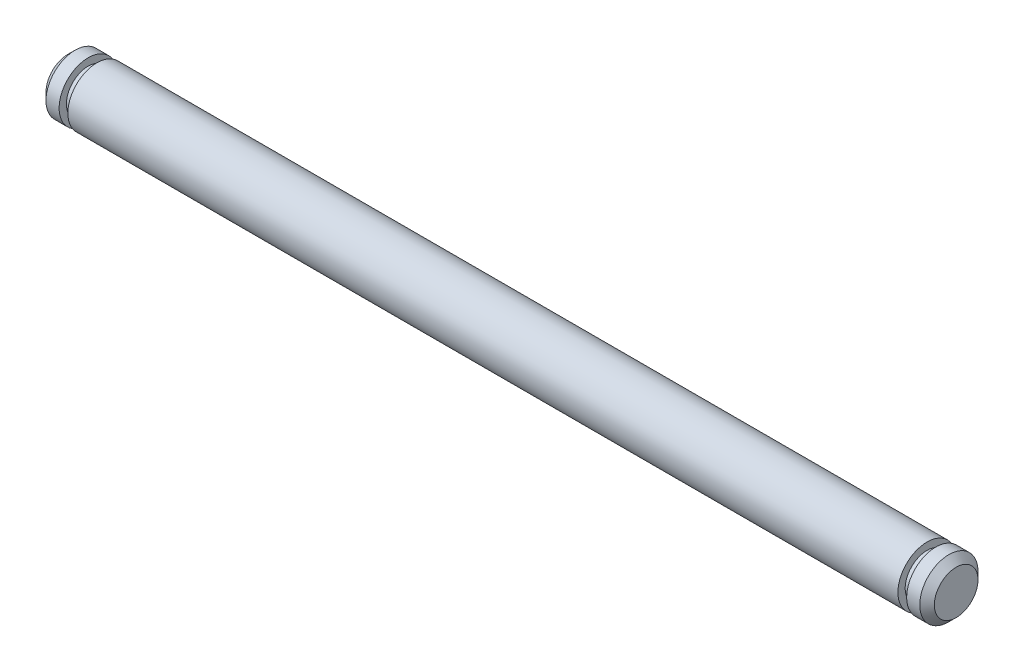
ISO-10303-21;
HEADER;
FILE_DESCRIPTION(('STEP AP214'),'2;1');
FILE_NAME('part.step','',(''),(''),'','','');
FILE_SCHEMA(('AUTOMOTIVE_DESIGN { 1 0 10303 214 1 1 1 1 }'));
ENDSEC;
DATA;
#1=APPLICATION_CONTEXT('core data for automotive mechanical design processes');
#2=APPLICATION_PROTOCOL_DEFINITION('international standard','automotive_design',2000,#1);
#3=PRODUCT_CONTEXT('',#1,'mechanical');
#4=PRODUCT('Part','Part','',(#3));
#5=PRODUCT_RELATED_PRODUCT_CATEGORY('part','',(#4));
#6=PRODUCT_DEFINITION_FORMATION('','',#4);
#7=PRODUCT_DEFINITION_CONTEXT('part definition',#1,'design');
#8=PRODUCT_DEFINITION('design','',#6,#7);
#9=PRODUCT_DEFINITION_SHAPE('','',#8);
#10=(LENGTH_UNIT() NAMED_UNIT(*) SI_UNIT(.MILLI.,.METRE.));
#11=(NAMED_UNIT(*) PLANE_ANGLE_UNIT() SI_UNIT($,.RADIAN.));
#12=(NAMED_UNIT(*) SI_UNIT($,.STERADIAN.) SOLID_ANGLE_UNIT());
#13=UNCERTAINTY_MEASURE_WITH_UNIT(LENGTH_MEASURE(1.E-05),#10,'distance_accuracy_value','');
#14=(GEOMETRIC_REPRESENTATION_CONTEXT(3) GLOBAL_UNCERTAINTY_ASSIGNED_CONTEXT((#13)) GLOBAL_UNIT_ASSIGNED_CONTEXT((#10,
#11,#12)) REPRESENTATION_CONTEXT('',''));
#15=CARTESIAN_POINT('',(0.,0.,0.));
#16=DIRECTION('',(0.,0.,1.));
#17=DIRECTION('',(1.,0.,0.));
#18=AXIS2_PLACEMENT_3D('',#15,#16,#17);
#19=CARTESIAN_POINT('',(30.5,2.,0.));
#20=DIRECTION('',(-1.,0.,0.));
#21=DIRECTION('',(0.,0.,1.));
#22=AXIS2_PLACEMENT_3D('',#19,#20,#21);
#23=PLANE('',#22);
#24=CARTESIAN_POINT('',(30.5000000000177,0.,0.));
#25=DIRECTION('',(-1.,0.,0.));
#26=DIRECTION('',(0.,0.,1.));
#27=AXIS2_PLACEMENT_3D('',#24,#25,#26);
#28=CIRCLE('',#27,1.49999999996453);
#29=CARTESIAN_POINT('',(30.5000000000177,0.,1.49999999996453));
#30=VERTEX_POINT('',#29);
#31=EDGE_CURVE('E17',#30,#30,#28,.T.);
#32=ORIENTED_EDGE('',*,*,#31,.F.);
#33=EDGE_LOOP('',(#32));
#34=FACE_BOUND('',#33,.T.);
#35=ADVANCED_FACE('F14',(#34),#23,.F.);
#36=CARTESIAN_POINT('',(-30.5,2.,0.));
#37=DIRECTION('',(1.,0.,0.));
#38=DIRECTION('',(0.,0.,-1.));
#39=AXIS2_PLACEMENT_3D('',#36,#37,#38);
#40=PLANE('',#39);
#41=CARTESIAN_POINT('',(-30.5000000000746,0.,0.));
#42=DIRECTION('',(1.,0.,0.));
#43=DIRECTION('',(0.,1.,0.));
#44=AXIS2_PLACEMENT_3D('',#41,#42,#43);
#45=CIRCLE('',#44,1.50000000002137);
#46=CARTESIAN_POINT('',(-30.5000000000746,1.50000000002137,0.));
#47=VERTEX_POINT('',#46);
#48=EDGE_CURVE('E49',#47,#47,#45,.T.);
#49=ORIENTED_EDGE('',*,*,#48,.F.);
#50=EDGE_LOOP('',(#49));
#51=FACE_BOUND('',#50,.T.);
#52=ADVANCED_FACE('F61',(#51),#40,.F.);
#53=CARTESIAN_POINT('',(30.0000000000864,0.,0.));
#54=DIRECTION('',(-1.,0.,0.));
#55=DIRECTION('',(0.,0.,1.));
#56=AXIS2_PLACEMENT_3D('',#53,#54,#55);
#57=CONICAL_SURFACE('',#56,1.99999999989586,0.785398163397448);
#58=ORIENTED_EDGE('',*,*,#31,.T.);
#59=EDGE_LOOP('',(#58));
#60=FACE_BOUND('',#59,.T.);
#61=CARTESIAN_POINT('',(30.,0.,0.));
#62=DIRECTION('',(-1.,0.,0.));
#63=DIRECTION('',(0.,0.,1.));
#64=AXIS2_PLACEMENT_3D('',#61,#62,#63);
#65=CIRCLE('',#64,2.);
#66=CARTESIAN_POINT('',(30.,0.,2.));
#67=VERTEX_POINT('',#66);
#68=EDGE_CURVE('E29',#67,#67,#65,.T.);
#69=ORIENTED_EDGE('',*,*,#68,.F.);
#70=EDGE_LOOP('',(#69));
#71=FACE_BOUND('',#70,.T.);
#72=ADVANCED_FACE('F57',(#60,#71),#57,.T.);
#73=CARTESIAN_POINT('',(-30.0000000000296,0.,0.));
#74=DIRECTION('',(1.,0.,0.));
#75=DIRECTION('',(0.,1.,0.));
#76=AXIS2_PLACEMENT_3D('',#73,#74,#75);
#77=CONICAL_SURFACE('',#76,2.00000000006639,0.785398163397448);
#78=CARTESIAN_POINT('',(-30.,0.,0.));
#79=DIRECTION('',(-1.,0.,0.));
#80=DIRECTION('',(0.,0.,1.));
#81=AXIS2_PLACEMENT_3D('',#78,#79,#80);
#82=CIRCLE('',#81,2.);
#83=CARTESIAN_POINT('',(-30.,0.,2.));
#84=VERTEX_POINT('',#83);
#85=EDGE_CURVE('E48',#84,#84,#82,.F.);
#86=ORIENTED_EDGE('',*,*,#85,.F.);
#87=EDGE_LOOP('',(#86));
#88=FACE_BOUND('',#87,.T.);
#89=ORIENTED_EDGE('',*,*,#48,.T.);
#90=EDGE_LOOP('',(#89));
#91=FACE_BOUND('',#90,.T.);
#92=ADVANCED_FACE('F106',(#88,#91),#77,.T.);
#93=CARTESIAN_POINT('',(0.,0.,0.));
#94=DIRECTION('',(-1.,0.,0.));
#95=DIRECTION('',(0.,0.,1.));
#96=AXIS2_PLACEMENT_3D('',#93,#94,#95);
#97=CYLINDRICAL_SURFACE('',#96,2.);
#98=ORIENTED_EDGE('',*,*,#68,.T.);
#99=EDGE_LOOP('',(#98));
#100=FACE_BOUND('',#99,.T.);
#101=CARTESIAN_POINT('',(29.1,0.,0.));
#102=DIRECTION('',(-1.,0.,0.));
#103=DIRECTION('',(0.,0.,1.));
#104=AXIS2_PLACEMENT_3D('',#101,#102,#103);
#105=CIRCLE('',#104,2.);
#106=CARTESIAN_POINT('',(29.1,0.,2.));
#107=VERTEX_POINT('',#106);
#108=EDGE_CURVE('E46',#107,#107,#105,.F.);
#109=ORIENTED_EDGE('',*,*,#108,.T.);
#110=EDGE_LOOP('',(#109));
#111=FACE_BOUND('',#110,.T.);
#112=ADVANCED_FACE('F102',(#100,#111),#97,.T.);
#113=CARTESIAN_POINT('',(0.,0.,0.));
#114=DIRECTION('',(-1.,0.,0.));
#115=DIRECTION('',(0.,0.,1.));
#116=AXIS2_PLACEMENT_3D('',#113,#114,#115);
#117=CYLINDRICAL_SURFACE('',#116,2.);
#118=ORIENTED_EDGE('',*,*,#85,.T.);
#119=EDGE_LOOP('',(#118));
#120=FACE_BOUND('',#119,.T.);
#121=CARTESIAN_POINT('',(-29.1,0.,0.));
#122=DIRECTION('',(-1.,0.,0.));
#123=DIRECTION('',(0.,0.,1.));
#124=AXIS2_PLACEMENT_3D('',#121,#122,#123);
#125=CIRCLE('',#124,2.);
#126=CARTESIAN_POINT('',(-29.1,0.,2.));
#127=VERTEX_POINT('',#126);
#128=EDGE_CURVE('E43',#127,#127,#125,.T.);
#129=ORIENTED_EDGE('',*,*,#128,.T.);
#130=EDGE_LOOP('',(#129));
#131=FACE_BOUND('',#130,.T.);
#132=ADVANCED_FACE('F98',(#120,#131),#117,.T.);
#133=CARTESIAN_POINT('',(29.1,0.,0.));
#134=DIRECTION('',(1.,0.,0.));
#135=DIRECTION('',(0.,0.,-1.));
#136=AXIS2_PLACEMENT_3D('',#133,#134,#135);
#137=PLANE('',#136);
#138=CARTESIAN_POINT('',(29.1,0.,0.));
#139=DIRECTION('',(1.,0.,0.));
#140=DIRECTION('',(0.,0.,-1.));
#141=AXIS2_PLACEMENT_3D('',#138,#139,#140);
#142=CIRCLE('',#141,1.5);
#143=CARTESIAN_POINT('',(29.1,0.,-1.5));
#144=VERTEX_POINT('',#143);
#145=EDGE_CURVE('E40',#144,#144,#142,.F.);
#146=ORIENTED_EDGE('',*,*,#145,.F.);
#147=EDGE_LOOP('',(#146));
#148=FACE_BOUND('',#147,.T.);
#149=ORIENTED_EDGE('',*,*,#108,.F.);
#150=EDGE_LOOP('',(#149));
#151=FACE_BOUND('',#150,.T.);
#152=ADVANCED_FACE('F94',(#148,#151),#137,.F.);
#153=CARTESIAN_POINT('',(-29.1,0.,0.));
#154=DIRECTION('',(-1.,0.,0.));
#155=DIRECTION('',(0.,0.,1.));
#156=AXIS2_PLACEMENT_3D('',#153,#154,#155);
#157=PLANE('',#156);
#158=ORIENTED_EDGE('',*,*,#128,.F.);
#159=EDGE_LOOP('',(#158));
#160=FACE_BOUND('',#159,.T.);
#161=CARTESIAN_POINT('',(-29.1,0.,0.));
#162=DIRECTION('',(-1.,0.,0.));
#163=DIRECTION('',(0.,0.,1.));
#164=AXIS2_PLACEMENT_3D('',#161,#162,#163);
#165=CIRCLE('',#164,1.5);
#166=CARTESIAN_POINT('',(-29.1,0.,1.5));
#167=VERTEX_POINT('',#166);
#168=EDGE_CURVE('E37',#167,#167,#165,.F.);
#169=ORIENTED_EDGE('',*,*,#168,.F.);
#170=EDGE_LOOP('',(#169));
#171=FACE_BOUND('',#170,.T.);
#172=ADVANCED_FACE('F90',(#160,#171),#157,.F.);
#173=CARTESIAN_POINT('',(28.5,0.,0.));
#174=DIRECTION('',(1.,0.,0.));
#175=DIRECTION('',(0.,0.,-1.));
#176=AXIS2_PLACEMENT_3D('',#173,#174,#175);
#177=CYLINDRICAL_SURFACE('',#176,1.5);
#178=ORIENTED_EDGE('',*,*,#145,.T.);
#179=EDGE_LOOP('',(#178));
#180=FACE_BOUND('',#179,.T.);
#181=CARTESIAN_POINT('',(28.5,0.,0.));
#182=DIRECTION('',(1.,0.,0.));
#183=DIRECTION('',(0.,0.,-1.));
#184=AXIS2_PLACEMENT_3D('',#181,#182,#183);
#185=CIRCLE('',#184,1.5);
#186=CARTESIAN_POINT('',(28.5,0.,-1.5));
#187=VERTEX_POINT('',#186);
#188=EDGE_CURVE('E34',#187,#187,#185,.F.);
#189=ORIENTED_EDGE('',*,*,#188,.F.);
#190=EDGE_LOOP('',(#189));
#191=FACE_BOUND('',#190,.T.);
#192=ADVANCED_FACE('F86',(#180,#191),#177,.T.);
#193=CARTESIAN_POINT('',(-28.5,0.,0.));
#194=DIRECTION('',(-1.,0.,0.));
#195=DIRECTION('',(0.,0.,1.));
#196=AXIS2_PLACEMENT_3D('',#193,#194,#195);
#197=CYLINDRICAL_SURFACE('',#196,1.5);
#198=ORIENTED_EDGE('',*,*,#168,.T.);
#199=EDGE_LOOP('',(#198));
#200=FACE_BOUND('',#199,.T.);
#201=CARTESIAN_POINT('',(-28.5,0.,0.));
#202=DIRECTION('',(-1.,0.,0.));
#203=DIRECTION('',(0.,0.,1.));
#204=AXIS2_PLACEMENT_3D('',#201,#202,#203);
#205=CIRCLE('',#204,1.5);
#206=CARTESIAN_POINT('',(-28.5,0.,1.5));
#207=VERTEX_POINT('',#206);
#208=EDGE_CURVE('E26',#207,#207,#205,.F.);
#209=ORIENTED_EDGE('',*,*,#208,.F.);
#210=EDGE_LOOP('',(#209));
#211=FACE_BOUND('',#210,.T.);
#212=ADVANCED_FACE('F82',(#200,#211),#197,.T.);
#213=CARTESIAN_POINT('',(28.5,0.,0.));
#214=DIRECTION('',(1.,0.,0.));
#215=DIRECTION('',(0.,0.,-1.));
#216=AXIS2_PLACEMENT_3D('',#213,#214,#215);
#217=PLANE('',#216);
#218=CARTESIAN_POINT('',(28.5,0.,0.));
#219=DIRECTION('',(-1.,0.,0.));
#220=DIRECTION('',(0.,0.,1.));
#221=AXIS2_PLACEMENT_3D('',#218,#219,#220);
#222=CIRCLE('',#221,2.);
#223=CARTESIAN_POINT('',(28.5,0.,2.));
#224=VERTEX_POINT('',#223);
#225=EDGE_CURVE('E21',#224,#224,#222,.T.);
#226=ORIENTED_EDGE('',*,*,#225,.F.);
#227=EDGE_LOOP('',(#226));
#228=FACE_BOUND('',#227,.T.);
#229=ORIENTED_EDGE('',*,*,#188,.T.);
#230=EDGE_LOOP('',(#229));
#231=FACE_BOUND('',#230,.T.);
#232=ADVANCED_FACE('F75',(#228,#231),#217,.T.);
#233=CARTESIAN_POINT('',(-28.5,0.,0.));
#234=DIRECTION('',(-1.,0.,0.));
#235=DIRECTION('',(0.,0.,1.));
#236=AXIS2_PLACEMENT_3D('',#233,#234,#235);
#237=PLANE('',#236);
#238=ORIENTED_EDGE('',*,*,#208,.T.);
#239=EDGE_LOOP('',(#238));
#240=FACE_BOUND('',#239,.T.);
#241=CARTESIAN_POINT('',(-28.5,0.,0.));
#242=DIRECTION('',(-1.,0.,0.));
#243=DIRECTION('',(0.,0.,1.));
#244=AXIS2_PLACEMENT_3D('',#241,#242,#243);
#245=CIRCLE('',#244,2.);
#246=CARTESIAN_POINT('',(-28.5,0.,2.));
#247=VERTEX_POINT('',#246);
#248=EDGE_CURVE('E10',#247,#247,#245,.F.);
#249=ORIENTED_EDGE('',*,*,#248,.F.);
#250=EDGE_LOOP('',(#249));
#251=FACE_BOUND('',#250,.T.);
#252=ADVANCED_FACE('F69',(#240,#251),#237,.T.);
#253=CARTESIAN_POINT('',(0.,0.,0.));
#254=DIRECTION('',(-1.,0.,0.));
#255=DIRECTION('',(0.,0.,1.));
#256=AXIS2_PLACEMENT_3D('',#253,#254,#255);
#257=CYLINDRICAL_SURFACE('',#256,2.);
#258=ORIENTED_EDGE('',*,*,#248,.T.);
#259=EDGE_LOOP('',(#258));
#260=FACE_BOUND('',#259,.T.);
#261=ORIENTED_EDGE('',*,*,#225,.T.);
#262=EDGE_LOOP('',(#261));
#263=FACE_BOUND('',#262,.T.);
#264=ADVANCED_FACE('F67',(#260,#263),#257,.T.);
#265=CLOSED_SHELL('',(#35,#52,#72,#92,#112,#132,#152,#172,#192,#212,#232,#252,#264));
#266=MANIFOLD_SOLID_BREP('B1',#265);
#267=ADVANCED_BREP_SHAPE_REPRESENTATION('',(#18,#266),#14);
#268=SHAPE_DEFINITION_REPRESENTATION(#9,#267);
ENDSEC;
END-ISO-10303-21;
